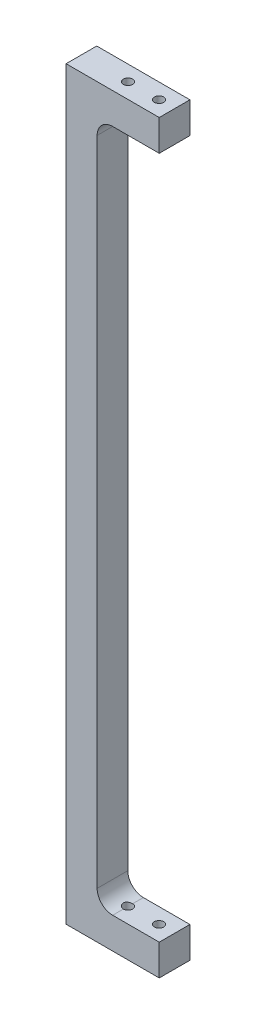
ISO-10303-21;
HEADER;
FILE_DESCRIPTION(('STEP AP214'),'2;1');
FILE_NAME('part.step','',(''),(''),'','','');
FILE_SCHEMA(('AUTOMOTIVE_DESIGN { 1 0 10303 214 1 1 1 1 }'));
ENDSEC;
DATA;
#1=APPLICATION_CONTEXT('core data for automotive mechanical design processes');
#2=APPLICATION_PROTOCOL_DEFINITION('international standard','automotive_design',2000,#1);
#3=PRODUCT_CONTEXT('',#1,'mechanical');
#4=PRODUCT('Part','Part','',(#3));
#5=PRODUCT_RELATED_PRODUCT_CATEGORY('part','',(#4));
#6=PRODUCT_DEFINITION_FORMATION('','',#4);
#7=PRODUCT_DEFINITION_CONTEXT('part definition',#1,'design');
#8=PRODUCT_DEFINITION('design','',#6,#7);
#9=PRODUCT_DEFINITION_SHAPE('','',#8);
#10=(LENGTH_UNIT() NAMED_UNIT(*) SI_UNIT(.MILLI.,.METRE.));
#11=(NAMED_UNIT(*) PLANE_ANGLE_UNIT() SI_UNIT($,.RADIAN.));
#12=(NAMED_UNIT(*) SI_UNIT($,.STERADIAN.) SOLID_ANGLE_UNIT());
#13=UNCERTAINTY_MEASURE_WITH_UNIT(LENGTH_MEASURE(1.E-05),#10,'distance_accuracy_value','');
#14=(GEOMETRIC_REPRESENTATION_CONTEXT(3) GLOBAL_UNCERTAINTY_ASSIGNED_CONTEXT((#13)) GLOBAL_UNIT_ASSIGNED_CONTEXT((#10,
#11,#12)) REPRESENTATION_CONTEXT('',''));
#15=CARTESIAN_POINT('',(0.,0.,0.));
#16=DIRECTION('',(0.,0.,1.));
#17=DIRECTION('',(1.,0.,0.));
#18=AXIS2_PLACEMENT_3D('',#15,#16,#17);
#19=CARTESIAN_POINT('',(5.,240.,4.9375));
#20=DIRECTION('',(-1.,0.,0.));
#21=DIRECTION('',(0.,0.,1.));
#22=AXIS2_PLACEMENT_3D('',#19,#20,#21);
#23=PLANE('',#22);
#24=DIRECTION('',(0.,-1.,0.));
#25=VECTOR('',#24,1.);
#26=CARTESIAN_POINT('',(5.,240.,-4.9375));
#27=LINE('',#26,#25);
#28=CARTESIAN_POINT('',(5.,225.,-4.9375));
#29=VERTEX_POINT('',#28);
#30=CARTESIAN_POINT('',(5.,15.,-4.9375));
#31=VERTEX_POINT('',#30);
#32=EDGE_CURVE('E195',#29,#31,#27,.T.);
#33=ORIENTED_EDGE('',*,*,#32,.F.);
#34=DIRECTION('',(0.,0.,-1.));
#35=VECTOR('',#34,1.);
#36=CARTESIAN_POINT('',(5.,225.,4.9375));
#37=LINE('',#36,#35);
#38=CARTESIAN_POINT('',(5.,225.,4.9375));
#39=VERTEX_POINT('',#38);
#40=EDGE_CURVE('E211',#29,#39,#37,.F.);
#41=ORIENTED_EDGE('',*,*,#40,.T.);
#42=DIRECTION('',(0.,-1.,0.));
#43=VECTOR('',#42,1.);
#44=CARTESIAN_POINT('',(5.,240.,4.9375));
#45=LINE('',#44,#43);
#46=CARTESIAN_POINT('',(5.,15.,4.9375));
#47=VERTEX_POINT('',#46);
#48=EDGE_CURVE('E184',#39,#47,#45,.T.);
#49=ORIENTED_EDGE('',*,*,#48,.T.);
#50=DIRECTION('',(0.,0.,1.));
#51=VECTOR('',#50,1.);
#52=CARTESIAN_POINT('',(5.,15.,-4.9375));
#53=LINE('',#52,#51);
#54=EDGE_CURVE('E209',#47,#31,#53,.F.);
#55=ORIENTED_EDGE('',*,*,#54,.T.);
#56=EDGE_LOOP('',(#33,#41,#49,#55));
#57=FACE_BOUND('',#56,.T.);
#58=ADVANCED_FACE('F36',(#57),#23,.F.);
#59=CARTESIAN_POINT('',(-5.,240.,-4.9375));
#60=DIRECTION('',(0.,0.,1.));
#61=DIRECTION('',(1.,0.,0.));
#62=AXIS2_PLACEMENT_3D('',#59,#60,#61);
#63=PLANE('',#62);
#64=DIRECTION('',(-1.,0.,0.));
#65=VECTOR('',#64,1.);
#66=CARTESIAN_POINT('',(-5.,0.,-4.9375));
#67=LINE('',#66,#65);
#68=CARTESIAN_POINT('',(25.,0.,-4.9375));
#69=VERTEX_POINT('',#68);
#70=CARTESIAN_POINT('',(-5.,0.,-4.9375));
#71=VERTEX_POINT('',#70);
#72=EDGE_CURVE('E180',#69,#71,#67,.T.);
#73=ORIENTED_EDGE('',*,*,#72,.T.);
#74=DIRECTION('',(0.,-1.,0.));
#75=VECTOR('',#74,1.);
#76=CARTESIAN_POINT('',(-5.,240.,-4.9375));
#77=LINE('',#76,#75);
#78=CARTESIAN_POINT('',(-5.,240.,-4.9375));
#79=VERTEX_POINT('',#78);
#80=EDGE_CURVE('E134',#79,#71,#77,.T.);
#81=ORIENTED_EDGE('',*,*,#80,.F.);
#82=DIRECTION('',(-1.,0.,0.));
#83=VECTOR('',#82,1.);
#84=CARTESIAN_POINT('',(-5.,240.,-4.9375));
#85=LINE('',#84,#83);
#86=CARTESIAN_POINT('',(25.,240.,-4.9375));
#87=VERTEX_POINT('',#86);
#88=EDGE_CURVE('E127',#87,#79,#85,.T.);
#89=ORIENTED_EDGE('',*,*,#88,.F.);
#90=DIRECTION('',(0.,1.,0.));
#91=VECTOR('',#90,1.);
#92=CARTESIAN_POINT('',(25.,240.,-4.9375));
#93=LINE('',#92,#91);
#94=CARTESIAN_POINT('',(25.,230.,-4.9375));
#95=VERTEX_POINT('',#94);
#96=EDGE_CURVE('E132',#95,#87,#93,.T.);
#97=ORIENTED_EDGE('',*,*,#96,.F.);
#98=DIRECTION('',(-1.,0.,0.));
#99=VECTOR('',#98,1.);
#100=CARTESIAN_POINT('',(25.,230.,-4.9375));
#101=LINE('',#100,#99);
#102=CARTESIAN_POINT('',(10.,230.,-4.9375));
#103=VERTEX_POINT('',#102);
#104=EDGE_CURVE('E161',#95,#103,#101,.T.);
#105=ORIENTED_EDGE('',*,*,#104,.T.);
#106=CARTESIAN_POINT('',(10.,225.,-4.9375));
#107=DIRECTION('',(0.,0.,1.));
#108=DIRECTION('',(1.,0.,0.));
#109=AXIS2_PLACEMENT_3D('',#106,#107,#108);
#110=CIRCLE('',#109,5.);
#111=EDGE_CURVE('E224',#103,#29,#110,.T.);
#112=ORIENTED_EDGE('',*,*,#111,.T.);
#113=ORIENTED_EDGE('',*,*,#32,.T.);
#114=CARTESIAN_POINT('',(10.,15.,-4.9375));
#115=DIRECTION('',(0.,0.,1.));
#116=DIRECTION('',(1.,0.,0.));
#117=AXIS2_PLACEMENT_3D('',#114,#115,#116);
#118=CIRCLE('',#117,5.);
#119=CARTESIAN_POINT('',(10.,10.,-4.9375));
#120=VERTEX_POINT('',#119);
#121=EDGE_CURVE('E11',#31,#120,#118,.T.);
#122=ORIENTED_EDGE('',*,*,#121,.T.);
#123=DIRECTION('',(-1.,0.,0.));
#124=VECTOR('',#123,1.);
#125=CARTESIAN_POINT('',(25.,10.,-4.9375));
#126=LINE('',#125,#124);
#127=CARTESIAN_POINT('',(25.,10.,-4.9375));
#128=VERTEX_POINT('',#127);
#129=EDGE_CURVE('E179',#128,#120,#126,.T.);
#130=ORIENTED_EDGE('',*,*,#129,.F.);
#131=DIRECTION('',(0.,1.,0.));
#132=VECTOR('',#131,1.);
#133=CARTESIAN_POINT('',(25.,0.,-4.9375));
#134=LINE('',#133,#132);
#135=EDGE_CURVE('E166',#69,#128,#134,.T.);
#136=ORIENTED_EDGE('',*,*,#135,.F.);
#137=EDGE_LOOP('',(#73,#81,#89,#97,#105,#112,#113,#122,#130,#136));
#138=FACE_BOUND('',#137,.T.);
#139=ADVANCED_FACE('F129',(#138),#63,.F.);
#140=CARTESIAN_POINT('',(-5.,240.,4.9375));
#141=DIRECTION('',(1.,0.,0.));
#142=DIRECTION('',(0.,0.,-1.));
#143=AXIS2_PLACEMENT_3D('',#140,#141,#142);
#144=PLANE('',#143);
#145=DIRECTION('',(0.,0.,1.));
#146=VECTOR('',#145,1.);
#147=CARTESIAN_POINT('',(-5.,0.,4.9375));
#148=LINE('',#147,#146);
#149=CARTESIAN_POINT('',(-5.,0.,4.9375));
#150=VERTEX_POINT('',#149);
#151=EDGE_CURVE('E186',#71,#150,#148,.T.);
#152=ORIENTED_EDGE('',*,*,#151,.T.);
#153=DIRECTION('',(0.,-1.,0.));
#154=VECTOR('',#153,1.);
#155=CARTESIAN_POINT('',(-5.,240.,4.9375));
#156=LINE('',#155,#154);
#157=CARTESIAN_POINT('',(-5.,240.,4.9375));
#158=VERTEX_POINT('',#157);
#159=EDGE_CURVE('E191',#158,#150,#156,.T.);
#160=ORIENTED_EDGE('',*,*,#159,.F.);
#161=DIRECTION('',(0.,0.,1.));
#162=VECTOR('',#161,1.);
#163=CARTESIAN_POINT('',(-5.,240.,4.9375));
#164=LINE('',#163,#162);
#165=EDGE_CURVE('E137',#79,#158,#164,.T.);
#166=ORIENTED_EDGE('',*,*,#165,.F.);
#167=ORIENTED_EDGE('',*,*,#80,.T.);
#168=EDGE_LOOP('',(#152,#160,#166,#167));
#169=FACE_BOUND('',#168,.T.);
#170=ADVANCED_FACE('F239',(#169),#144,.F.);
#171=CARTESIAN_POINT('',(-5.,240.,4.9375));
#172=DIRECTION('',(0.,0.,-1.));
#173=DIRECTION('',(-1.,0.,0.));
#174=AXIS2_PLACEMENT_3D('',#171,#172,#173);
#175=PLANE('',#174);
#176=DIRECTION('',(1.,0.,0.));
#177=VECTOR('',#176,1.);
#178=CARTESIAN_POINT('',(-5.,0.,4.9375));
#179=LINE('',#178,#177);
#180=CARTESIAN_POINT('',(25.,0.,4.9375));
#181=VERTEX_POINT('',#180);
#182=EDGE_CURVE('E138',#150,#181,#179,.T.);
#183=ORIENTED_EDGE('',*,*,#182,.T.);
#184=DIRECTION('',(0.,-1.,0.));
#185=VECTOR('',#184,1.);
#186=CARTESIAN_POINT('',(25.,0.,4.9375));
#187=LINE('',#186,#185);
#188=CARTESIAN_POINT('',(25.,10.,4.9375));
#189=VERTEX_POINT('',#188);
#190=EDGE_CURVE('E171',#189,#181,#187,.T.);
#191=ORIENTED_EDGE('',*,*,#190,.F.);
#192=DIRECTION('',(-1.,0.,0.));
#193=VECTOR('',#192,1.);
#194=CARTESIAN_POINT('',(25.,10.,4.9375));
#195=LINE('',#194,#193);
#196=CARTESIAN_POINT('',(10.,10.,4.9375));
#197=VERTEX_POINT('',#196);
#198=EDGE_CURVE('E177',#189,#197,#195,.T.);
#199=ORIENTED_EDGE('',*,*,#198,.T.);
#200=CARTESIAN_POINT('',(10.,15.,4.9375));
#201=DIRECTION('',(0.,0.,-1.));
#202=DIRECTION('',(-1.,0.,0.));
#203=AXIS2_PLACEMENT_3D('',#200,#201,#202);
#204=CIRCLE('',#203,5.);
#205=EDGE_CURVE('E45',#197,#47,#204,.T.);
#206=ORIENTED_EDGE('',*,*,#205,.T.);
#207=ORIENTED_EDGE('',*,*,#48,.F.);
#208=CARTESIAN_POINT('',(10.,225.,4.9375));
#209=DIRECTION('',(0.,0.,-1.));
#210=DIRECTION('',(-1.,0.,0.));
#211=AXIS2_PLACEMENT_3D('',#208,#209,#210);
#212=CIRCLE('',#211,5.);
#213=CARTESIAN_POINT('',(10.,230.,4.9375));
#214=VERTEX_POINT('',#213);
#215=EDGE_CURVE('E312',#39,#214,#212,.T.);
#216=ORIENTED_EDGE('',*,*,#215,.T.);
#217=DIRECTION('',(-1.,0.,0.));
#218=VECTOR('',#217,1.);
#219=CARTESIAN_POINT('',(25.,230.,4.9375));
#220=LINE('',#219,#218);
#221=CARTESIAN_POINT('',(25.,230.,4.9375));
#222=VERTEX_POINT('',#221);
#223=EDGE_CURVE('E163',#222,#214,#220,.T.);
#224=ORIENTED_EDGE('',*,*,#223,.F.);
#225=DIRECTION('',(0.,-1.,0.));
#226=VECTOR('',#225,1.);
#227=CARTESIAN_POINT('',(25.,240.,4.9375));
#228=LINE('',#227,#226);
#229=CARTESIAN_POINT('',(25.,240.,4.9375));
#230=VERTEX_POINT('',#229);
#231=EDGE_CURVE('E147',#230,#222,#228,.T.);
#232=ORIENTED_EDGE('',*,*,#231,.F.);
#233=DIRECTION('',(1.,0.,0.));
#234=VECTOR('',#233,1.);
#235=CARTESIAN_POINT('',(-5.,240.,4.9375));
#236=LINE('',#235,#234);
#237=EDGE_CURVE('E144',#158,#230,#236,.T.);
#238=ORIENTED_EDGE('',*,*,#237,.F.);
#239=ORIENTED_EDGE('',*,*,#159,.T.);
#240=EDGE_LOOP('',(#183,#191,#199,#206,#207,#216,#224,#232,#238,#239));
#241=FACE_BOUND('',#240,.T.);
#242=ADVANCED_FACE('F242',(#241),#175,.F.);
#243=CARTESIAN_POINT('',(0.,240.,0.));
#244=DIRECTION('',(0.,-1.,0.));
#245=DIRECTION('',(0.,0.,-1.));
#246=AXIS2_PLACEMENT_3D('',#243,#244,#245);
#247=PLANE('',#246);
#248=CARTESIAN_POINT('',(10.,240.,0.));
#249=DIRECTION('',(0.,1.,0.));
#250=DIRECTION('',(0.,0.,1.));
#251=AXIS2_PLACEMENT_3D('',#248,#249,#250);
#252=CIRCLE('',#251,1.5);
#253=CARTESIAN_POINT('',(10.,240.,1.5));
#254=VERTEX_POINT('',#253);
#255=EDGE_CURVE('E293',#254,#254,#252,.T.);
#256=ORIENTED_EDGE('',*,*,#255,.F.);
#257=EDGE_LOOP('',(#256));
#258=FACE_BOUND('',#257,.T.);
#259=CARTESIAN_POINT('',(20.,240.,0.));
#260=DIRECTION('',(0.,1.,0.));
#261=DIRECTION('',(0.,0.,1.));
#262=AXIS2_PLACEMENT_3D('',#259,#260,#261);
#263=CIRCLE('',#262,1.5);
#264=CARTESIAN_POINT('',(20.,240.,1.5));
#265=VERTEX_POINT('',#264);
#266=EDGE_CURVE('E286',#265,#265,#263,.T.);
#267=ORIENTED_EDGE('',*,*,#266,.F.);
#268=EDGE_LOOP('',(#267));
#269=FACE_BOUND('',#268,.T.);
#270=ORIENTED_EDGE('',*,*,#237,.T.);
#271=DIRECTION('',(0.,0.,1.));
#272=VECTOR('',#271,1.);
#273=CARTESIAN_POINT('',(25.,240.,-4.9375));
#274=LINE('',#273,#272);
#275=EDGE_CURVE('E141',#87,#230,#274,.T.);
#276=ORIENTED_EDGE('',*,*,#275,.F.);
#277=ORIENTED_EDGE('',*,*,#88,.T.);
#278=ORIENTED_EDGE('',*,*,#165,.T.);
#279=EDGE_LOOP('',(#270,#276,#277,#278));
#280=FACE_BOUND('',#279,.T.);
#281=ADVANCED_FACE('F142',(#258,#269,#280),#247,.F.);
#282=CARTESIAN_POINT('',(0.,0.,0.));
#283=DIRECTION('',(0.,-1.,0.));
#284=DIRECTION('',(0.,0.,-1.));
#285=AXIS2_PLACEMENT_3D('',#282,#283,#284);
#286=PLANE('',#285);
#287=CARTESIAN_POINT('',(10.,0.,0.));
#288=DIRECTION('',(0.,1.,0.));
#289=DIRECTION('',(0.,0.,1.));
#290=AXIS2_PLACEMENT_3D('',#287,#288,#289);
#291=CIRCLE('',#290,1.5);
#292=CARTESIAN_POINT('',(10.,0.,1.5));
#293=VERTEX_POINT('',#292);
#294=EDGE_CURVE('E202',#293,#293,#291,.T.);
#295=ORIENTED_EDGE('',*,*,#294,.T.);
#296=EDGE_LOOP('',(#295));
#297=FACE_BOUND('',#296,.T.);
#298=CARTESIAN_POINT('',(20.,0.,0.));
#299=DIRECTION('',(0.,1.,0.));
#300=DIRECTION('',(0.,0.,1.));
#301=AXIS2_PLACEMENT_3D('',#298,#299,#300);
#302=CIRCLE('',#301,1.5);
#303=CARTESIAN_POINT('',(20.,0.,1.5));
#304=VERTEX_POINT('',#303);
#305=EDGE_CURVE('E290',#304,#304,#302,.T.);
#306=ORIENTED_EDGE('',*,*,#305,.T.);
#307=EDGE_LOOP('',(#306));
#308=FACE_BOUND('',#307,.T.);
#309=ORIENTED_EDGE('',*,*,#72,.F.);
#310=DIRECTION('',(0.,0.,-1.));
#311=VECTOR('',#310,1.);
#312=CARTESIAN_POINT('',(25.,0.,-4.9375));
#313=LINE('',#312,#311);
#314=EDGE_CURVE('E174',#181,#69,#313,.T.);
#315=ORIENTED_EDGE('',*,*,#314,.F.);
#316=ORIENTED_EDGE('',*,*,#182,.F.);
#317=ORIENTED_EDGE('',*,*,#151,.F.);
#318=EDGE_LOOP('',(#309,#315,#316,#317));
#319=FACE_BOUND('',#318,.T.);
#320=ADVANCED_FACE('F247',(#297,#308,#319),#286,.T.);
#321=CARTESIAN_POINT('',(25.,10.,-4.9375));
#322=DIRECTION('',(0.,-1.,0.));
#323=DIRECTION('',(0.,0.,-1.));
#324=AXIS2_PLACEMENT_3D('',#321,#322,#323);
#325=PLANE('',#324);
#326=ORIENTED_EDGE('',*,*,#129,.T.);
#327=DIRECTION('',(0.,0.,1.));
#328=VECTOR('',#327,1.);
#329=CARTESIAN_POINT('',(10.,10.,4.9375));
#330=LINE('',#329,#328);
#331=CARTESIAN_POINT('',(10.,10.,-1.5));
#332=VERTEX_POINT('',#331);
#333=EDGE_CURVE('E214',#120,#332,#330,.T.);
#334=ORIENTED_EDGE('',*,*,#333,.T.);
#335=CARTESIAN_POINT('',(10.,10.,0.));
#336=DIRECTION('',(0.,-1.,0.));
#337=DIRECTION('',(0.,0.,-1.));
#338=AXIS2_PLACEMENT_3D('',#335,#336,#337);
#339=CIRCLE('',#338,1.5);
#340=CARTESIAN_POINT('',(10.,10.,1.5));
#341=VERTEX_POINT('',#340);
#342=EDGE_CURVE('E153',#332,#341,#339,.T.);
#343=ORIENTED_EDGE('',*,*,#342,.T.);
#344=DIRECTION('',(0.,0.,1.));
#345=VECTOR('',#344,1.);
#346=CARTESIAN_POINT('',(10.,10.,4.9375));
#347=LINE('',#346,#345);
#348=EDGE_CURVE('E58',#341,#197,#347,.T.);
#349=ORIENTED_EDGE('',*,*,#348,.T.);
#350=ORIENTED_EDGE('',*,*,#198,.F.);
#351=DIRECTION('',(0.,0.,1.));
#352=VECTOR('',#351,1.);
#353=CARTESIAN_POINT('',(25.,10.,-4.9375));
#354=LINE('',#353,#352);
#355=EDGE_CURVE('E169',#128,#189,#354,.T.);
#356=ORIENTED_EDGE('',*,*,#355,.F.);
#357=EDGE_LOOP('',(#326,#334,#343,#349,#350,#356));
#358=FACE_BOUND('',#357,.T.);
#359=CARTESIAN_POINT('',(20.,10.,0.));
#360=DIRECTION('',(0.,-1.,0.));
#361=DIRECTION('',(0.,0.,-1.));
#362=AXIS2_PLACEMENT_3D('',#359,#360,#361);
#363=CIRCLE('',#362,1.5);
#364=CARTESIAN_POINT('',(20.,10.,-1.5));
#365=VERTEX_POINT('',#364);
#366=EDGE_CURVE('E201',#365,#365,#363,.T.);
#367=ORIENTED_EDGE('',*,*,#366,.T.);
#368=EDGE_LOOP('',(#367));
#369=FACE_BOUND('',#368,.T.);
#370=ADVANCED_FACE('F250',(#358,#369),#325,.F.);
#371=CARTESIAN_POINT('',(25.,0.,0.));
#372=DIRECTION('',(1.,0.,0.));
#373=DIRECTION('',(0.,0.,-1.));
#374=AXIS2_PLACEMENT_3D('',#371,#372,#373);
#375=PLANE('',#374);
#376=ORIENTED_EDGE('',*,*,#135,.T.);
#377=ORIENTED_EDGE('',*,*,#355,.T.);
#378=ORIENTED_EDGE('',*,*,#190,.T.);
#379=ORIENTED_EDGE('',*,*,#314,.T.);
#380=EDGE_LOOP('',(#376,#377,#378,#379));
#381=FACE_BOUND('',#380,.T.);
#382=ADVANCED_FACE('F257',(#381),#375,.T.);
#383=CARTESIAN_POINT('',(25.,230.,-4.9375));
#384=DIRECTION('',(0.,1.,0.));
#385=DIRECTION('',(0.,0.,1.));
#386=AXIS2_PLACEMENT_3D('',#383,#384,#385);
#387=PLANE('',#386);
#388=ORIENTED_EDGE('',*,*,#223,.T.);
#389=DIRECTION('',(0.,0.,-1.));
#390=VECTOR('',#389,1.);
#391=CARTESIAN_POINT('',(10.,230.,-4.9375));
#392=LINE('',#391,#390);
#393=CARTESIAN_POINT('',(10.,230.,1.5));
#394=VERTEX_POINT('',#393);
#395=EDGE_CURVE('E206',#214,#394,#392,.T.);
#396=ORIENTED_EDGE('',*,*,#395,.T.);
#397=CARTESIAN_POINT('',(10.,230.,0.));
#398=DIRECTION('',(0.,1.,0.));
#399=DIRECTION('',(0.,0.,1.));
#400=AXIS2_PLACEMENT_3D('',#397,#398,#399);
#401=CIRCLE('',#400,1.5);
#402=CARTESIAN_POINT('',(10.,230.,-1.5));
#403=VERTEX_POINT('',#402);
#404=EDGE_CURVE('E155',#394,#403,#401,.T.);
#405=ORIENTED_EDGE('',*,*,#404,.T.);
#406=DIRECTION('',(0.,0.,-1.));
#407=VECTOR('',#406,1.);
#408=CARTESIAN_POINT('',(10.,230.,-4.9375));
#409=LINE('',#408,#407);
#410=EDGE_CURVE('E197',#403,#103,#409,.T.);
#411=ORIENTED_EDGE('',*,*,#410,.T.);
#412=ORIENTED_EDGE('',*,*,#104,.F.);
#413=DIRECTION('',(0.,0.,-1.));
#414=VECTOR('',#413,1.);
#415=CARTESIAN_POINT('',(25.,230.,-4.9375));
#416=LINE('',#415,#414);
#417=EDGE_CURVE('E151',#222,#95,#416,.T.);
#418=ORIENTED_EDGE('',*,*,#417,.F.);
#419=EDGE_LOOP('',(#388,#396,#405,#411,#412,#418));
#420=FACE_BOUND('',#419,.T.);
#421=CARTESIAN_POINT('',(20.,230.,0.));
#422=DIRECTION('',(0.,1.,0.));
#423=DIRECTION('',(0.,0.,1.));
#424=AXIS2_PLACEMENT_3D('',#421,#422,#423);
#425=CIRCLE('',#424,1.5);
#426=CARTESIAN_POINT('',(20.,230.,1.5));
#427=VERTEX_POINT('',#426);
#428=EDGE_CURVE('E198',#427,#427,#425,.T.);
#429=ORIENTED_EDGE('',*,*,#428,.T.);
#430=EDGE_LOOP('',(#429));
#431=FACE_BOUND('',#430,.T.);
#432=ADVANCED_FACE('F260',(#420,#431),#387,.F.);
#433=CARTESIAN_POINT('',(25.,0.,0.));
#434=DIRECTION('',(-1.,0.,0.));
#435=DIRECTION('',(0.,0.,1.));
#436=AXIS2_PLACEMENT_3D('',#433,#434,#435);
#437=PLANE('',#436);
#438=ORIENTED_EDGE('',*,*,#96,.T.);
#439=ORIENTED_EDGE('',*,*,#275,.T.);
#440=ORIENTED_EDGE('',*,*,#231,.T.);
#441=ORIENTED_EDGE('',*,*,#417,.T.);
#442=EDGE_LOOP('',(#438,#439,#440,#441));
#443=FACE_BOUND('',#442,.T.);
#444=ADVANCED_FACE('F149',(#443),#437,.F.);
#445=CARTESIAN_POINT('',(20.,0.,0.));
#446=DIRECTION('',(0.,1.,0.));
#447=DIRECTION('',(0.,0.,1.));
#448=AXIS2_PLACEMENT_3D('',#445,#446,#447);
#449=CYLINDRICAL_SURFACE('',#448,1.5);
#450=ORIENTED_EDGE('',*,*,#266,.T.);
#451=EDGE_LOOP('',(#450));
#452=FACE_BOUND('',#451,.T.);
#453=ORIENTED_EDGE('',*,*,#428,.F.);
#454=EDGE_LOOP('',(#453));
#455=FACE_BOUND('',#454,.T.);
#456=ADVANCED_FACE('F266',(#452,#455),#449,.F.);
#457=CARTESIAN_POINT('',(10.,0.,0.));
#458=DIRECTION('',(0.,1.,0.));
#459=DIRECTION('',(0.,0.,1.));
#460=AXIS2_PLACEMENT_3D('',#457,#458,#459);
#461=CYLINDRICAL_SURFACE('',#460,1.5);
#462=ORIENTED_EDGE('',*,*,#255,.T.);
#463=EDGE_LOOP('',(#462));
#464=FACE_BOUND('',#463,.T.);
#465=ORIENTED_EDGE('',*,*,#404,.F.);
#466=CARTESIAN_POINT('',(10.,230.,1.5));
#467=CARTESIAN_POINT('',(9.95877831486209,230.000002775401,1.50000074088228));
#468=CARTESIAN_POINT('',(9.91757722763893,229.99948961836,1.49829967584819));
#469=CARTESIAN_POINT('',(9.83548680290017,229.997461048149,1.49152015595063));
#470=CARTESIAN_POINT('',(9.79459740517713,229.995945833772,1.48644237097767));
#471=CARTESIAN_POINT('',(9.67304210297741,229.989954212583,1.46622618623275));
#472=CARTESIAN_POINT('',(9.59321746377706,229.98403144129,1.44610455372686));
#473=CARTESIAN_POINT('',(9.43826425562063,229.968956669393,1.39325670100849));
#474=CARTESIAN_POINT('',(9.36313459295795,229.959805424195,1.36053342919717));
#475=CARTESIAN_POINT('',(9.21939709433969,229.939224003567,1.28347556917447));
#476=CARTESIAN_POINT('',(9.15079182180858,229.927792937817,1.2391364425884));
#477=CARTESIAN_POINT('',(9.02012909691675,229.903507733661,1.13877738187436));
#478=CARTESIAN_POINT('',(8.95828519491843,229.890624575853,1.08248657547265));
#479=CARTESIAN_POINT('',(8.84475401231381,229.865059063948,0.960394545800004));
#480=CARTESIAN_POINT('',(8.79306902071916,229.852376755697,0.894591184938011));
#481=CARTESIAN_POINT('',(8.70019845164698,229.828340857024,0.753527575608338));
#482=CARTESIAN_POINT('',(8.65927497907871,229.817023539123,0.678088010815735));
#483=CARTESIAN_POINT('',(8.59078478211035,229.797435816111,0.521006933559129));
#484=CARTESIAN_POINT('',(8.56321422961724,229.789164537906,0.439367206367321));
#485=CARTESIAN_POINT('',(8.5229838733941,229.776908774064,0.274610614285424));
#486=CARTESIAN_POINT('',(8.50992831770001,229.772810781159,0.191599054307657));
#487=CARTESIAN_POINT('',(8.49786267516884,229.769027891552,0.0244686646846428));
#488=CARTESIAN_POINT('',(8.49884948802593,229.769342020733,-0.0596499164526457));
#489=CARTESIAN_POINT('',(8.51453026825763,229.774247453735,-0.223384348908578));
#490=CARTESIAN_POINT('',(8.52872809791372,229.778683934868,-0.303053121928058));
#491=CARTESIAN_POINT('',(8.56962609265122,229.791083649017,-0.45882061887147));
#492=CARTESIAN_POINT('',(8.5963273553065,229.799047191641,-0.534919028737171));
#493=CARTESIAN_POINT('',(8.66183993359859,229.817727393671,-0.682600843493004));
#494=CARTESIAN_POINT('',(8.7008122769506,229.828480305407,-0.754108033586538));
#495=CARTESIAN_POINT('',(8.78964851570763,229.851510033816,-0.889732885793138));
#496=CARTESIAN_POINT('',(8.83951490571262,229.863787199246,-0.953848850262723));
#497=CARTESIAN_POINT('',(8.9511813674356,229.889108882142,-1.07568024023528));
#498=CARTESIAN_POINT('',(9.01339211691642,229.902164057606,-1.1330176421046));
#499=CARTESIAN_POINT('',(9.14672420741939,229.927120151179,-1.23654519931824));
#500=CARTESIAN_POINT('',(9.2178478042158,229.939020775722,-1.28273252397135));
#501=CARTESIAN_POINT('',(9.36768569462724,229.960438037079,-1.362883646878));
#502=CARTESIAN_POINT('',(9.44645096101764,229.969936889603,-1.39675702803259));
#503=CARTESIAN_POINT('',(9.60886993424313,229.985342187074,-1.45062447982789));
#504=CARTESIAN_POINT('',(9.69251629137853,229.991253887799,-1.47063886233264));
#505=CARTESIAN_POINT('',(9.81411627082464,229.996681219489,-1.48890712015452));
#506=CARTESIAN_POINT('',(9.85118853816699,229.997923491944,-1.49306666526516));
#507=CARTESIAN_POINT('',(9.92550098259344,229.999582818905,-1.49861053003616));
#508=CARTESIAN_POINT('',(9.96274081396564,230.000001139001,-1.49999910594285));
#509=CARTESIAN_POINT('',(9.99999999999999,230.,-1.50000000000005));
#510=B_SPLINE_CURVE_WITH_KNOTS('',3,(#466,#467,#468,#469,#470,#471,#472,#473,#474,#475,#476,
#477,#478,#479,#480,#481,#482,#483,#484,#485,#486,#487,#488,#489,#490,#491,#492,#493,#494,#495,
#496,#497,#498,#499,#500,#501,#502,#503,#504,#505,#506,#507,#508,#509),.UNSPECIFIED.,.F.,.F.,(4,
2,2,2,2,2,2,2,2,2,2,2,2,2,2,2,2,2,2,2,2,4),(0.,0.123586349299501,0.247148188235244,
0.493467705903282,0.739729627259743,0.986087908292366,1.23877657706037,1.4915221166828,
1.74994856887332,2.00830088994152,2.25942192987993,2.51048752760879,2.75248923057987,
2.99451218087957,3.23985364377019,3.4852513457732,3.74087441324125,3.9965623081359,
4.25409142087118,4.51124229334191,4.62312535209809,4.73483642426841),.UNSPECIFIED.);
#511=EDGE_CURVE('E217',#394,#403,#510,.T.);
#512=ORIENTED_EDGE('',*,*,#511,.T.);
#513=EDGE_LOOP('',(#465,#512));
#514=FACE_BOUND('',#513,.T.);
#515=ADVANCED_FACE('F269',(#464,#514),#461,.F.);
#516=ORIENTED_EDGE('',*,*,#305,.F.);
#517=EDGE_LOOP('',(#516));
#518=FACE_BOUND('',#517,.T.);
#519=ORIENTED_EDGE('',*,*,#366,.F.);
#520=EDGE_LOOP('',(#519));
#521=FACE_BOUND('',#520,.T.);
#522=ADVANCED_FACE('F267',(#518,#521),#449,.F.);
#523=ORIENTED_EDGE('',*,*,#294,.F.);
#524=EDGE_LOOP('',(#523));
#525=FACE_BOUND('',#524,.T.);
#526=ORIENTED_EDGE('',*,*,#342,.F.);
#527=CARTESIAN_POINT('',(10.,10.,-1.5));
#528=CARTESIAN_POINT('',(9.95877831486209,9.99999722459885,-1.50000074088228));
#529=CARTESIAN_POINT('',(9.91757722763893,10.0005103816396,-1.49829967584819));
#530=CARTESIAN_POINT('',(9.83548680290017,10.0025389518508,-1.49152015595063));
#531=CARTESIAN_POINT('',(9.79459740517713,10.0040541662279,-1.48644237097767));
#532=CARTESIAN_POINT('',(9.67304210297741,10.0100457874173,-1.46622618623275));
#533=CARTESIAN_POINT('',(9.59321746377706,10.0159685587099,-1.44610455372686));
#534=CARTESIAN_POINT('',(9.43826425562063,10.0310433306074,-1.39325670100849));
#535=CARTESIAN_POINT('',(9.36313459295795,10.0401945758054,-1.36053342919717));
#536=CARTESIAN_POINT('',(9.21939709433969,10.0607759964331,-1.28347556917447));
#537=CARTESIAN_POINT('',(9.15079182180858,10.072207062183,-1.2391364425884));
#538=CARTESIAN_POINT('',(9.02012909691675,10.0964922663388,-1.13877738187436));
#539=CARTESIAN_POINT('',(8.95828519491843,10.1093754241475,-1.08248657547265));
#540=CARTESIAN_POINT('',(8.84475401231381,10.1349409360524,-0.960394545800002));
#541=CARTESIAN_POINT('',(8.79306902071916,10.1476232443026,-0.894591184938008));
#542=CARTESIAN_POINT('',(8.70019845164698,10.1716591429759,-0.753527575608336));
#543=CARTESIAN_POINT('',(8.65927497907871,10.182976460877,-0.678088010815732));
#544=CARTESIAN_POINT('',(8.59078478211035,10.2025641838892,-0.521006933559126));
#545=CARTESIAN_POINT('',(8.56321422961724,10.2108354620937,-0.439367206367318));
#546=CARTESIAN_POINT('',(8.52298387339409,10.2230912259356,-0.274610614285419));
#547=CARTESIAN_POINT('',(8.50992831770001,10.2271892188411,-0.191599054307653));
#548=CARTESIAN_POINT('',(8.49786267516884,10.2309721084475,-0.0244686646846392));
#549=CARTESIAN_POINT('',(8.49884948802593,10.230657979267,0.0596499164526486));
#550=CARTESIAN_POINT('',(8.51453026825763,10.2257525462651,0.22338434890858));
#551=CARTESIAN_POINT('',(8.52872809791372,10.2213160651322,0.30305312192806));
#552=CARTESIAN_POINT('',(8.56962609265122,10.2089163509834,0.458820618871472));
#553=CARTESIAN_POINT('',(8.5963273553065,10.2009528083591,0.534919028737174));
#554=CARTESIAN_POINT('',(8.66183993359859,10.1822726063287,0.682600843493006));
#555=CARTESIAN_POINT('',(8.70081227695061,10.1715196945933,0.754108033586539));
#556=CARTESIAN_POINT('',(8.78964851570764,10.1484899661844,0.889732885793139));
#557=CARTESIAN_POINT('',(8.83951490571262,10.1362128007544,0.953848850262726));
#558=CARTESIAN_POINT('',(8.9511813674356,10.1108911178579,1.07568024023528));
#559=CARTESIAN_POINT('',(9.01339211691642,10.097835942394,1.1330176421046));
#560=CARTESIAN_POINT('',(9.14672420741939,10.072879848821,1.23654519931824));
#561=CARTESIAN_POINT('',(9.2178478042158,10.0609792242777,1.28273252397136));
#562=CARTESIAN_POINT('',(9.36768569462724,10.0395619629212,1.362883646878));
#563=CARTESIAN_POINT('',(9.44645096101764,10.0300631103965,1.39675702803259));
#564=CARTESIAN_POINT('',(9.60886993424313,10.0146578129262,1.45062447982789));
#565=CARTESIAN_POINT('',(9.69251629137853,10.0087461122008,1.47063886233264));
#566=CARTESIAN_POINT('',(9.81411627082464,10.0033187805108,1.48890712015452));
#567=CARTESIAN_POINT('',(9.85118853816699,10.002076508056,1.49306666526516));
#568=CARTESIAN_POINT('',(9.92550098259344,10.0004171810948,1.49861053003616));
#569=CARTESIAN_POINT('',(9.96274081396564,9.99999886099909,1.49999910594285));
#570=CARTESIAN_POINT('',(9.99999999999999,9.99999999999999,1.50000000000005));
#571=B_SPLINE_CURVE_WITH_KNOTS('',3,(#527,#528,#529,#530,#531,#532,#533,#534,#535,#536,#537,
#538,#539,#540,#541,#542,#543,#544,#545,#546,#547,#548,#549,#550,#551,#552,#553,#554,#555,#556,
#557,#558,#559,#560,#561,#562,#563,#564,#565,#566,#567,#568,#569,#570),.UNSPECIFIED.,.F.,.F.,(4,
2,2,2,2,2,2,2,2,2,2,2,2,2,2,2,2,2,2,2,2,4),(0.,0.1235863492995,0.247148188235244,
0.493467705903284,0.739729627259746,0.986087908292366,1.23877657706037,1.4915221166828,
1.74994856887332,2.00830088994152,2.25942192987994,2.51048752760879,2.75248923057987,
2.99451218087957,3.23985364377019,3.4852513457732,3.74087441324126,3.9965623081359,
4.25409142087118,4.51124229334192,4.62312535209809,4.73483642426842),.UNSPECIFIED.);
#572=EDGE_CURVE('E306',#332,#341,#571,.T.);
#573=ORIENTED_EDGE('',*,*,#572,.T.);
#574=EDGE_LOOP('',(#526,#573));
#575=FACE_BOUND('',#574,.T.);
#576=ADVANCED_FACE('F226',(#525,#575),#461,.F.);
#577=CARTESIAN_POINT('',(10.,225.,-4.9375));
#578=DIRECTION('',(0.,0.,1.));
#579=DIRECTION('',(1.,0.,0.));
#580=AXIS2_PLACEMENT_3D('',#577,#578,#579);
#581=CYLINDRICAL_SURFACE('',#580,5.);
#582=ORIENTED_EDGE('',*,*,#215,.F.);
#583=ORIENTED_EDGE('',*,*,#40,.F.);
#584=ORIENTED_EDGE('',*,*,#111,.F.);
#585=ORIENTED_EDGE('',*,*,#410,.F.);
#586=ORIENTED_EDGE('',*,*,#511,.F.);
#587=ORIENTED_EDGE('',*,*,#395,.F.);
#588=EDGE_LOOP('',(#582,#583,#584,#585,#586,#587));
#589=FACE_BOUND('',#588,.T.);
#590=ADVANCED_FACE('F229',(#589),#581,.F.);
#591=CARTESIAN_POINT('',(10.,15.,-4.9375));
#592=DIRECTION('',(0.,0.,-1.));
#593=DIRECTION('',(-1.,0.,0.));
#594=AXIS2_PLACEMENT_3D('',#591,#592,#593);
#595=CYLINDRICAL_SURFACE('',#594,5.);
#596=ORIENTED_EDGE('',*,*,#121,.F.);
#597=ORIENTED_EDGE('',*,*,#54,.F.);
#598=ORIENTED_EDGE('',*,*,#205,.F.);
#599=ORIENTED_EDGE('',*,*,#348,.F.);
#600=ORIENTED_EDGE('',*,*,#572,.F.);
#601=ORIENTED_EDGE('',*,*,#333,.F.);
#602=EDGE_LOOP('',(#596,#597,#598,#599,#600,#601));
#603=FACE_BOUND('',#602,.T.);
#604=ADVANCED_FACE('F38',(#603),#595,.F.);
#605=CLOSED_SHELL('',(#58,#139,#170,#242,#281,#320,#370,#382,#432,#444,#456,#515,#522,#576,#590,#604));
#606=MANIFOLD_SOLID_BREP('B2',#605);
#607=ADVANCED_BREP_SHAPE_REPRESENTATION('',(#18,#606),#14);
#608=SHAPE_DEFINITION_REPRESENTATION(#9,#607);
ENDSEC;
END-ISO-10303-21;
